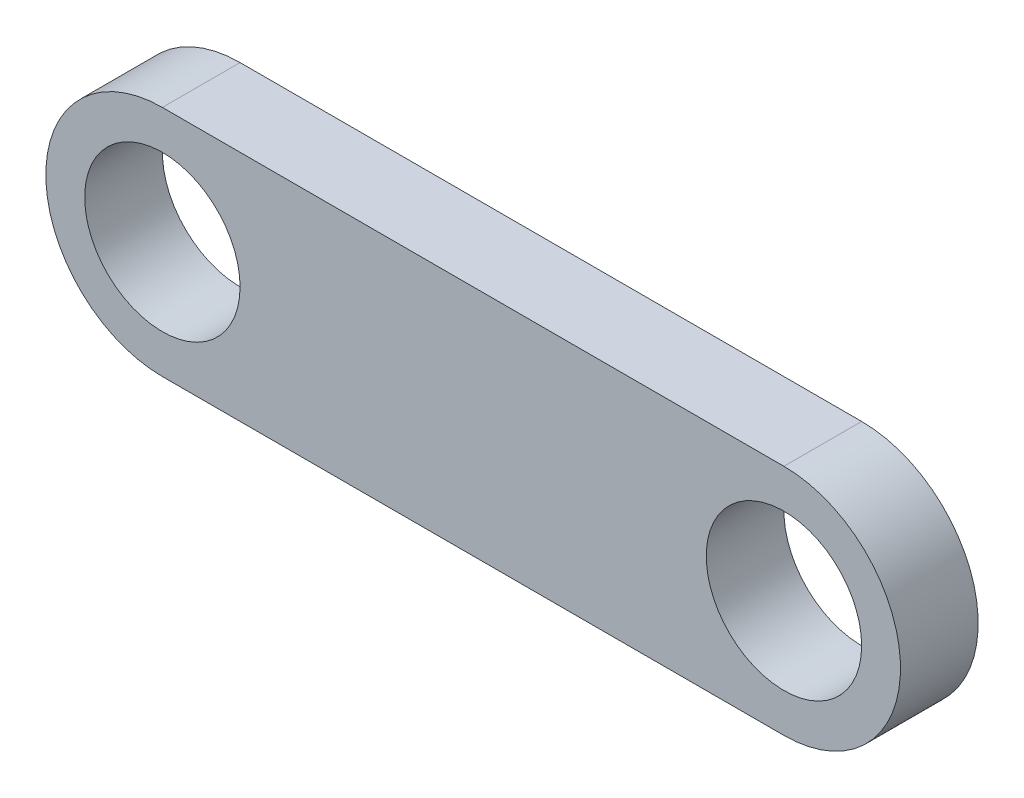
ISO-10303-21;
HEADER;
FILE_DESCRIPTION(('STEP AP214'),'2;1');
FILE_NAME('part.step','',(''),(''),'','','');
FILE_SCHEMA(('AUTOMOTIVE_DESIGN { 1 0 10303 214 1 1 1 1 }'));
ENDSEC;
DATA;
#1=APPLICATION_CONTEXT('core data for automotive mechanical design processes');
#2=APPLICATION_PROTOCOL_DEFINITION('international standard','automotive_design',2000,#1);
#3=PRODUCT_CONTEXT('',#1,'mechanical');
#4=PRODUCT('Part','Part','',(#3));
#5=PRODUCT_RELATED_PRODUCT_CATEGORY('part','',(#4));
#6=PRODUCT_DEFINITION_FORMATION('','',#4);
#7=PRODUCT_DEFINITION_CONTEXT('part definition',#1,'design');
#8=PRODUCT_DEFINITION('design','',#6,#7);
#9=PRODUCT_DEFINITION_SHAPE('','',#8);
#10=(LENGTH_UNIT() NAMED_UNIT(*) SI_UNIT(.MILLI.,.METRE.));
#11=(NAMED_UNIT(*) PLANE_ANGLE_UNIT() SI_UNIT($,.RADIAN.));
#12=(NAMED_UNIT(*) SI_UNIT($,.STERADIAN.) SOLID_ANGLE_UNIT());
#13=UNCERTAINTY_MEASURE_WITH_UNIT(LENGTH_MEASURE(1.E-05),#10,'distance_accuracy_value','');
#14=(GEOMETRIC_REPRESENTATION_CONTEXT(3) GLOBAL_UNCERTAINTY_ASSIGNED_CONTEXT((#13)) GLOBAL_UNIT_ASSIGNED_CONTEXT((#10,
#11,#12)) REPRESENTATION_CONTEXT('',''));
#15=CARTESIAN_POINT('',(0.,0.,0.));
#16=DIRECTION('',(0.,0.,1.));
#17=DIRECTION('',(1.,0.,0.));
#18=AXIS2_PLACEMENT_3D('',#15,#16,#17);
#19=CARTESIAN_POINT('',(0.,7.5,5.));
#20=DIRECTION('',(0.,-1.,0.));
#21=DIRECTION('',(1.,0.,0.));
#22=AXIS2_PLACEMENT_3D('',#19,#20,#21);
#23=PLANE('',#22);
#24=DIRECTION('',(0.,0.,1.));
#25=VECTOR('',#24,1.);
#26=CARTESIAN_POINT('',(40.,7.50000000000001,5.));
#27=LINE('',#26,#25);
#28=CARTESIAN_POINT('',(40.,7.50000000000001,0.));
#29=VERTEX_POINT('',#28);
#30=CARTESIAN_POINT('',(40.,7.50000000000001,5.));
#31=VERTEX_POINT('',#30);
#32=EDGE_CURVE('E11',#29,#31,#27,.T.);
#33=ORIENTED_EDGE('',*,*,#32,.F.);
#34=DIRECTION('',(1.,0.,0.));
#35=VECTOR('',#34,1.);
#36=CARTESIAN_POINT('',(0.,7.5,0.));
#37=LINE('',#36,#35);
#38=CARTESIAN_POINT('',(0.,7.5,0.));
#39=VERTEX_POINT('',#38);
#40=EDGE_CURVE('E94',#39,#29,#37,.T.);
#41=ORIENTED_EDGE('',*,*,#40,.F.);
#42=DIRECTION('',(0.,0.,1.));
#43=VECTOR('',#42,1.);
#44=CARTESIAN_POINT('',(0.,7.5,5.));
#45=LINE('',#44,#43);
#46=CARTESIAN_POINT('',(0.,7.5,5.));
#47=VERTEX_POINT('',#46);
#48=EDGE_CURVE('E48',#39,#47,#45,.T.);
#49=ORIENTED_EDGE('',*,*,#48,.T.);
#50=DIRECTION('',(1.,0.,0.));
#51=VECTOR('',#50,1.);
#52=CARTESIAN_POINT('',(0.,7.5,5.));
#53=LINE('',#52,#51);
#54=EDGE_CURVE('E113',#47,#31,#53,.T.);
#55=ORIENTED_EDGE('',*,*,#54,.T.);
#56=EDGE_LOOP('',(#33,#41,#49,#55));
#57=FACE_BOUND('',#56,.T.);
#58=ADVANCED_FACE('F38',(#57),#23,.F.);
#59=CARTESIAN_POINT('',(0.,0.,5.));
#60=DIRECTION('',(0.,0.,1.));
#61=DIRECTION('',(1.,0.,0.));
#62=AXIS2_PLACEMENT_3D('',#59,#60,#61);
#63=CYLINDRICAL_SURFACE('',#62,7.5);
#64=ORIENTED_EDGE('',*,*,#48,.F.);
#65=CARTESIAN_POINT('',(0.,0.,0.));
#66=DIRECTION('',(0.,0.,1.));
#67=DIRECTION('',(1.,0.,0.));
#68=AXIS2_PLACEMENT_3D('',#65,#66,#67);
#69=CIRCLE('',#68,7.5);
#70=CARTESIAN_POINT('',(0.,-7.5,0.));
#71=VERTEX_POINT('',#70);
#72=EDGE_CURVE('E101',#39,#71,#69,.T.);
#73=ORIENTED_EDGE('',*,*,#72,.T.);
#74=DIRECTION('',(0.,0.,1.));
#75=VECTOR('',#74,1.);
#76=CARTESIAN_POINT('',(0.,-7.5,5.));
#77=LINE('',#76,#75);
#78=CARTESIAN_POINT('',(0.,-7.5,5.));
#79=VERTEX_POINT('',#78);
#80=EDGE_CURVE('E56',#71,#79,#77,.T.);
#81=ORIENTED_EDGE('',*,*,#80,.T.);
#82=CARTESIAN_POINT('',(0.,0.,5.));
#83=DIRECTION('',(0.,0.,1.));
#84=DIRECTION('',(1.,0.,0.));
#85=AXIS2_PLACEMENT_3D('',#82,#83,#84);
#86=CIRCLE('',#85,7.5);
#87=EDGE_CURVE('E118',#47,#79,#86,.T.);
#88=ORIENTED_EDGE('',*,*,#87,.F.);
#89=EDGE_LOOP('',(#64,#73,#81,#88));
#90=FACE_BOUND('',#89,.T.);
#91=ADVANCED_FACE('F120',(#90),#63,.T.);
#92=CARTESIAN_POINT('',(0.,-7.5,5.));
#93=DIRECTION('',(0.,-1.,0.));
#94=DIRECTION('',(1.,0.,0.));
#95=AXIS2_PLACEMENT_3D('',#92,#93,#94);
#96=PLANE('',#95);
#97=ORIENTED_EDGE('',*,*,#80,.F.);
#98=DIRECTION('',(1.,0.,0.));
#99=VECTOR('',#98,1.);
#100=CARTESIAN_POINT('',(0.,-7.5,0.));
#101=LINE('',#100,#99);
#102=CARTESIAN_POINT('',(40.,-7.50000000000001,0.));
#103=VERTEX_POINT('',#102);
#104=EDGE_CURVE('E93',#71,#103,#101,.T.);
#105=ORIENTED_EDGE('',*,*,#104,.T.);
#106=DIRECTION('',(0.,0.,1.));
#107=VECTOR('',#106,1.);
#108=CARTESIAN_POINT('',(40.,-7.50000000000001,5.));
#109=LINE('',#108,#107);
#110=CARTESIAN_POINT('',(40.,-7.50000000000001,5.));
#111=VERTEX_POINT('',#110);
#112=EDGE_CURVE('E42',#103,#111,#109,.T.);
#113=ORIENTED_EDGE('',*,*,#112,.T.);
#114=DIRECTION('',(1.,0.,0.));
#115=VECTOR('',#114,1.);
#116=CARTESIAN_POINT('',(0.,-7.5,5.));
#117=LINE('',#116,#115);
#118=EDGE_CURVE('E110',#79,#111,#117,.T.);
#119=ORIENTED_EDGE('',*,*,#118,.F.);
#120=EDGE_LOOP('',(#97,#105,#113,#119));
#121=FACE_BOUND('',#120,.T.);
#122=ADVANCED_FACE('F96',(#121),#96,.T.);
#123=CARTESIAN_POINT('',(40.,0.,5.));
#124=DIRECTION('',(0.,0.,1.));
#125=DIRECTION('',(1.,0.,0.));
#126=AXIS2_PLACEMENT_3D('',#123,#124,#125);
#127=CYLINDRICAL_SURFACE('',#126,7.50000000000001);
#128=CARTESIAN_POINT('',(40.,0.,0.));
#129=DIRECTION('',(0.,0.,1.));
#130=DIRECTION('',(1.,0.,0.));
#131=AXIS2_PLACEMENT_3D('',#128,#129,#130);
#132=CIRCLE('',#131,7.50000000000001);
#133=EDGE_CURVE('E81',#103,#29,#132,.T.);
#134=ORIENTED_EDGE('',*,*,#133,.T.);
#135=ORIENTED_EDGE('',*,*,#32,.T.);
#136=CARTESIAN_POINT('',(40.,0.,5.));
#137=DIRECTION('',(0.,0.,1.));
#138=DIRECTION('',(1.,0.,0.));
#139=AXIS2_PLACEMENT_3D('',#136,#137,#138);
#140=CIRCLE('',#139,7.50000000000001);
#141=EDGE_CURVE('E83',#111,#31,#140,.T.);
#142=ORIENTED_EDGE('',*,*,#141,.F.);
#143=ORIENTED_EDGE('',*,*,#112,.F.);
#144=EDGE_LOOP('',(#134,#135,#142,#143));
#145=FACE_BOUND('',#144,.T.);
#146=ADVANCED_FACE('F80',(#145),#127,.T.);
#147=CARTESIAN_POINT('',(0.,0.,5.));
#148=DIRECTION('',(0.,0.,1.));
#149=DIRECTION('',(1.,0.,0.));
#150=AXIS2_PLACEMENT_3D('',#147,#148,#149);
#151=CYLINDRICAL_SURFACE('',#150,5.);
#152=CARTESIAN_POINT('',(0.,0.,5.));
#153=DIRECTION('',(0.,0.,1.));
#154=DIRECTION('',(1.,0.,0.));
#155=AXIS2_PLACEMENT_3D('',#152,#153,#154);
#156=CIRCLE('',#155,5.);
#157=CARTESIAN_POINT('',(5.,0.,5.));
#158=VERTEX_POINT('',#157);
#159=EDGE_CURVE('E121',#158,#158,#156,.T.);
#160=ORIENTED_EDGE('',*,*,#159,.T.);
#161=EDGE_LOOP('',(#160));
#162=FACE_BOUND('',#161,.T.);
#163=CARTESIAN_POINT('',(0.,0.,0.));
#164=DIRECTION('',(0.,0.,1.));
#165=DIRECTION('',(1.,0.,0.));
#166=AXIS2_PLACEMENT_3D('',#163,#164,#165);
#167=CIRCLE('',#166,5.);
#168=CARTESIAN_POINT('',(5.,0.,0.));
#169=VERTEX_POINT('',#168);
#170=EDGE_CURVE('E103',#169,#169,#167,.T.);
#171=ORIENTED_EDGE('',*,*,#170,.F.);
#172=EDGE_LOOP('',(#171));
#173=FACE_BOUND('',#172,.T.);
#174=ADVANCED_FACE('F141',(#162,#173),#151,.F.);
#175=CARTESIAN_POINT('',(40.,0.,5.));
#176=DIRECTION('',(0.,0.,1.));
#177=DIRECTION('',(1.,0.,0.));
#178=AXIS2_PLACEMENT_3D('',#175,#176,#177);
#179=CYLINDRICAL_SURFACE('',#178,5.);
#180=CARTESIAN_POINT('',(40.,0.,5.));
#181=DIRECTION('',(0.,0.,1.));
#182=DIRECTION('',(1.,0.,0.));
#183=AXIS2_PLACEMENT_3D('',#180,#181,#182);
#184=CIRCLE('',#183,5.);
#185=CARTESIAN_POINT('',(45.,0.,5.));
#186=VERTEX_POINT('',#185);
#187=EDGE_CURVE('E87',#186,#186,#184,.T.);
#188=ORIENTED_EDGE('',*,*,#187,.T.);
#189=EDGE_LOOP('',(#188));
#190=FACE_BOUND('',#189,.T.);
#191=CARTESIAN_POINT('',(40.,0.,0.));
#192=DIRECTION('',(0.,0.,1.));
#193=DIRECTION('',(1.,0.,0.));
#194=AXIS2_PLACEMENT_3D('',#191,#192,#193);
#195=CIRCLE('',#194,5.);
#196=CARTESIAN_POINT('',(45.,0.,0.));
#197=VERTEX_POINT('',#196);
#198=EDGE_CURVE('E107',#197,#197,#195,.T.);
#199=ORIENTED_EDGE('',*,*,#198,.F.);
#200=EDGE_LOOP('',(#199));
#201=FACE_BOUND('',#200,.T.);
#202=ADVANCED_FACE('F40',(#190,#201),#179,.F.);
#203=CARTESIAN_POINT('',(0.,0.,5.));
#204=DIRECTION('',(0.,0.,1.));
#205=DIRECTION('',(1.,0.,0.));
#206=AXIS2_PLACEMENT_3D('',#203,#204,#205);
#207=PLANE('',#206);
#208=ORIENTED_EDGE('',*,*,#118,.T.);
#209=ORIENTED_EDGE('',*,*,#141,.T.);
#210=ORIENTED_EDGE('',*,*,#54,.F.);
#211=ORIENTED_EDGE('',*,*,#87,.T.);
#212=EDGE_LOOP('',(#208,#209,#210,#211));
#213=FACE_BOUND('',#212,.T.);
#214=ORIENTED_EDGE('',*,*,#159,.F.);
#215=EDGE_LOOP('',(#214));
#216=FACE_BOUND('',#215,.T.);
#217=ORIENTED_EDGE('',*,*,#187,.F.);
#218=EDGE_LOOP('',(#217));
#219=FACE_BOUND('',#218,.T.);
#220=ADVANCED_FACE('F116',(#213,#216,#219),#207,.T.);
#221=CARTESIAN_POINT('',(0.,0.,0.));
#222=DIRECTION('',(0.,0.,1.));
#223=DIRECTION('',(1.,0.,0.));
#224=AXIS2_PLACEMENT_3D('',#221,#222,#223);
#225=PLANE('',#224);
#226=ORIENTED_EDGE('',*,*,#104,.F.);
#227=ORIENTED_EDGE('',*,*,#72,.F.);
#228=ORIENTED_EDGE('',*,*,#40,.T.);
#229=ORIENTED_EDGE('',*,*,#133,.F.);
#230=EDGE_LOOP('',(#226,#227,#228,#229));
#231=FACE_BOUND('',#230,.T.);
#232=ORIENTED_EDGE('',*,*,#170,.T.);
#233=EDGE_LOOP('',(#232));
#234=FACE_BOUND('',#233,.T.);
#235=ORIENTED_EDGE('',*,*,#198,.T.);
#236=EDGE_LOOP('',(#235));
#237=FACE_BOUND('',#236,.T.);
#238=ADVANCED_FACE('F90',(#231,#234,#237),#225,.F.);
#239=CLOSED_SHELL('',(#58,#91,#122,#146,#174,#202,#220,#238));
#240=MANIFOLD_SOLID_BREP('B2',#239);
#241=ADVANCED_BREP_SHAPE_REPRESENTATION('',(#18,#240),#14);
#242=SHAPE_DEFINITION_REPRESENTATION(#9,#241);
ENDSEC;
END-ISO-10303-21;
